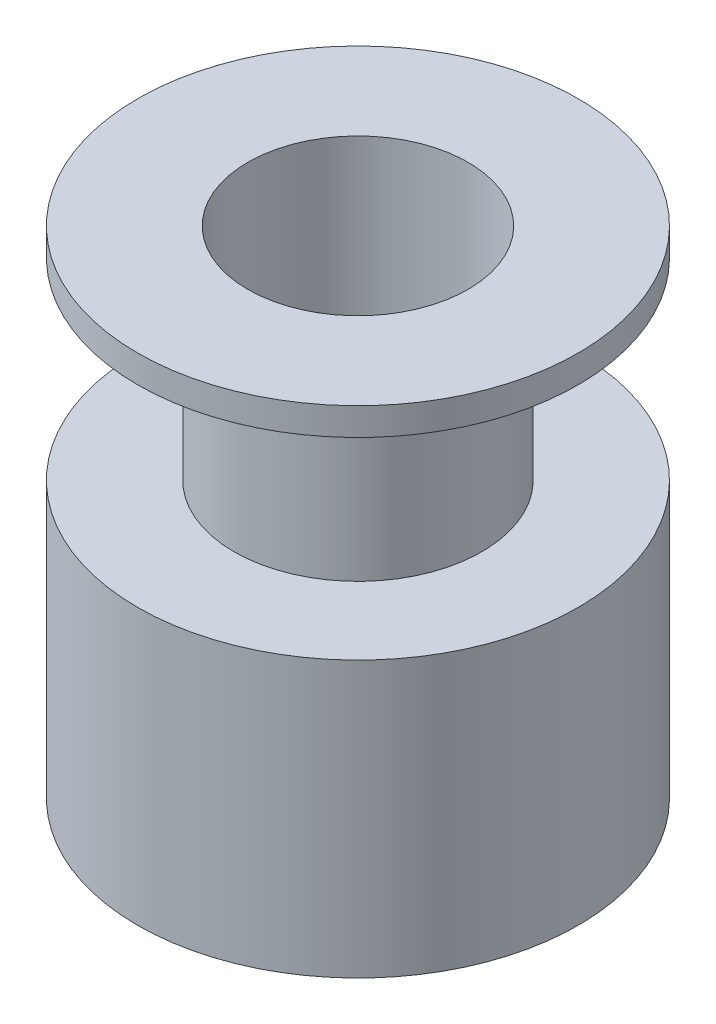
ISO-10303-21;
HEADER;
FILE_DESCRIPTION(('STEP AP214'),'2;1');
FILE_NAME('part.step','',(''),(''),'','','');
FILE_SCHEMA(('AUTOMOTIVE_DESIGN { 1 0 10303 214 1 1 1 1 }'));
ENDSEC;
DATA;
#1=APPLICATION_CONTEXT('core data for automotive mechanical design processes');
#2=APPLICATION_PROTOCOL_DEFINITION('international standard','automotive_design',2000,#1);
#3=PRODUCT_CONTEXT('',#1,'mechanical');
#4=PRODUCT('Part','Part','',(#3));
#5=PRODUCT_RELATED_PRODUCT_CATEGORY('part','',(#4));
#6=PRODUCT_DEFINITION_FORMATION('','',#4);
#7=PRODUCT_DEFINITION_CONTEXT('part definition',#1,'design');
#8=PRODUCT_DEFINITION('design','',#6,#7);
#9=PRODUCT_DEFINITION_SHAPE('','',#8);
#10=(LENGTH_UNIT() NAMED_UNIT(*) SI_UNIT(.MILLI.,.METRE.));
#11=(NAMED_UNIT(*) PLANE_ANGLE_UNIT() SI_UNIT($,.RADIAN.));
#12=(NAMED_UNIT(*) SI_UNIT($,.STERADIAN.) SOLID_ANGLE_UNIT());
#13=UNCERTAINTY_MEASURE_WITH_UNIT(LENGTH_MEASURE(1.E-05),#10,'distance_accuracy_value','');
#14=(GEOMETRIC_REPRESENTATION_CONTEXT(3) GLOBAL_UNCERTAINTY_ASSIGNED_CONTEXT((#13)) GLOBAL_UNIT_ASSIGNED_CONTEXT((#10,
#11,#12)) REPRESENTATION_CONTEXT('',''));
#15=CARTESIAN_POINT('',(0.,0.,0.));
#16=DIRECTION('',(0.,0.,1.));
#17=DIRECTION('',(1.,0.,0.));
#18=AXIS2_PLACEMENT_3D('',#15,#16,#17);
#19=CARTESIAN_POINT('',(0.,18.,0.));
#20=DIRECTION('',(0.,-1.,0.));
#21=DIRECTION('',(0.,0.,-1.));
#22=AXIS2_PLACEMENT_3D('',#19,#20,#21);
#23=CYLINDRICAL_SURFACE('',#22,8.);
#24=CARTESIAN_POINT('',(0.,0.,0.));
#25=DIRECTION('',(0.,1.,0.));
#26=DIRECTION('',(0.,0.,1.));
#27=AXIS2_PLACEMENT_3D('',#24,#25,#26);
#28=CIRCLE('',#27,8.);
#29=CARTESIAN_POINT('',(0.,0.,8.));
#30=VERTEX_POINT('',#29);
#31=EDGE_CURVE('E37',#30,#30,#28,.T.);
#32=ORIENTED_EDGE('',*,*,#31,.T.);
#33=EDGE_LOOP('',(#32));
#34=FACE_BOUND('',#33,.T.);
#35=CARTESIAN_POINT('',(0.,10.,0.));
#36=DIRECTION('',(0.,1.,0.));
#37=DIRECTION('',(0.,0.,1.));
#38=AXIS2_PLACEMENT_3D('',#35,#36,#37);
#39=CIRCLE('',#38,8.);
#40=CARTESIAN_POINT('',(0.,10.,8.));
#41=VERTEX_POINT('',#40);
#42=EDGE_CURVE('E49',#41,#41,#39,.T.);
#43=ORIENTED_EDGE('',*,*,#42,.F.);
#44=EDGE_LOOP('',(#43));
#45=FACE_BOUND('',#44,.T.);
#46=ADVANCED_FACE('F33',(#34,#45),#23,.T.);
#47=CARTESIAN_POINT('',(0.,17.,0.));
#48=DIRECTION('',(0.,1.,0.));
#49=DIRECTION('',(0.,0.,1.));
#50=AXIS2_PLACEMENT_3D('',#47,#48,#49);
#51=CIRCLE('',#50,8.);
#52=CARTESIAN_POINT('',(0.,17.,8.));
#53=VERTEX_POINT('',#52);
#54=EDGE_CURVE('E52',#53,#53,#51,.T.);
#55=ORIENTED_EDGE('',*,*,#54,.T.);
#56=EDGE_LOOP('',(#55));
#57=FACE_BOUND('',#56,.T.);
#58=CARTESIAN_POINT('',(0.,18.,0.));
#59=DIRECTION('',(0.,1.,0.));
#60=DIRECTION('',(0.,0.,1.));
#61=AXIS2_PLACEMENT_3D('',#58,#59,#60);
#62=CIRCLE('',#61,8.);
#63=CARTESIAN_POINT('',(0.,18.,8.));
#64=VERTEX_POINT('',#63);
#65=EDGE_CURVE('E10',#64,#64,#62,.T.);
#66=ORIENTED_EDGE('',*,*,#65,.F.);
#67=EDGE_LOOP('',(#66));
#68=FACE_BOUND('',#67,.T.);
#69=ADVANCED_FACE('F35',(#57,#68),#23,.T.);
#70=CARTESIAN_POINT('',(0.,18.,0.));
#71=DIRECTION('',(0.,1.,0.));
#72=DIRECTION('',(0.,0.,1.));
#73=AXIS2_PLACEMENT_3D('',#70,#71,#72);
#74=PLANE('',#73);
#75=CARTESIAN_POINT('',(0.,18.,0.));
#76=DIRECTION('',(0.,1.,0.));
#77=DIRECTION('',(0.,0.,1.));
#78=AXIS2_PLACEMENT_3D('',#75,#76,#77);
#79=CIRCLE('',#78,4.);
#80=CARTESIAN_POINT('',(0.,18.,4.));
#81=VERTEX_POINT('',#80);
#82=EDGE_CURVE('E46',#81,#81,#79,.T.);
#83=ORIENTED_EDGE('',*,*,#82,.F.);
#84=EDGE_LOOP('',(#83));
#85=FACE_BOUND('',#84,.T.);
#86=ORIENTED_EDGE('',*,*,#65,.T.);
#87=EDGE_LOOP('',(#86));
#88=FACE_BOUND('',#87,.T.);
#89=ADVANCED_FACE('F80',(#85,#88),#74,.T.);
#90=CARTESIAN_POINT('',(0.,0.,0.));
#91=DIRECTION('',(0.,1.,0.));
#92=DIRECTION('',(0.,0.,1.));
#93=AXIS2_PLACEMENT_3D('',#90,#91,#92);
#94=PLANE('',#93);
#95=CARTESIAN_POINT('',(0.,0.,0.));
#96=DIRECTION('',(0.,1.,0.));
#97=DIRECTION('',(0.,0.,1.));
#98=AXIS2_PLACEMENT_3D('',#95,#96,#97);
#99=CIRCLE('',#98,4.);
#100=CARTESIAN_POINT('',(0.,0.,4.));
#101=VERTEX_POINT('',#100);
#102=EDGE_CURVE('E44',#101,#101,#99,.T.);
#103=ORIENTED_EDGE('',*,*,#102,.T.);
#104=EDGE_LOOP('',(#103));
#105=FACE_BOUND('',#104,.T.);
#106=ORIENTED_EDGE('',*,*,#31,.F.);
#107=EDGE_LOOP('',(#106));
#108=FACE_BOUND('',#107,.T.);
#109=ADVANCED_FACE('F84',(#105,#108),#94,.F.);
#110=CARTESIAN_POINT('',(0.,0.,0.));
#111=DIRECTION('',(0.,1.,0.));
#112=DIRECTION('',(0.,0.,1.));
#113=AXIS2_PLACEMENT_3D('',#110,#111,#112);
#114=CYLINDRICAL_SURFACE('',#113,4.);
#115=ORIENTED_EDGE('',*,*,#102,.F.);
#116=EDGE_LOOP('',(#115));
#117=FACE_BOUND('',#116,.T.);
#118=ORIENTED_EDGE('',*,*,#82,.T.);
#119=EDGE_LOOP('',(#118));
#120=FACE_BOUND('',#119,.T.);
#121=ADVANCED_FACE('F71',(#117,#120),#114,.F.);
#122=CARTESIAN_POINT('',(0.,10.,0.));
#123=DIRECTION('',(0.,1.,0.));
#124=DIRECTION('',(0.,0.,1.));
#125=AXIS2_PLACEMENT_3D('',#122,#123,#124);
#126=PLANE('',#125);
#127=CARTESIAN_POINT('',(0.,10.,0.));
#128=DIRECTION('',(0.,1.,0.));
#129=DIRECTION('',(0.,0.,1.));
#130=AXIS2_PLACEMENT_3D('',#127,#128,#129);
#131=CIRCLE('',#130,4.5);
#132=CARTESIAN_POINT('',(0.,10.,4.5));
#133=VERTEX_POINT('',#132);
#134=EDGE_CURVE('E55',#133,#133,#131,.T.);
#135=ORIENTED_EDGE('',*,*,#134,.F.);
#136=EDGE_LOOP('',(#135));
#137=FACE_BOUND('',#136,.T.);
#138=ORIENTED_EDGE('',*,*,#42,.T.);
#139=EDGE_LOOP('',(#138));
#140=FACE_BOUND('',#139,.T.);
#141=ADVANCED_FACE('F67',(#137,#140),#126,.T.);
#142=CARTESIAN_POINT('',(0.,17.,0.));
#143=DIRECTION('',(0.,1.,0.));
#144=DIRECTION('',(0.,0.,1.));
#145=AXIS2_PLACEMENT_3D('',#142,#143,#144);
#146=PLANE('',#145);
#147=CARTESIAN_POINT('',(0.,17.,0.));
#148=DIRECTION('',(0.,1.,0.));
#149=DIRECTION('',(0.,0.,1.));
#150=AXIS2_PLACEMENT_3D('',#147,#148,#149);
#151=CIRCLE('',#150,4.5);
#152=CARTESIAN_POINT('',(0.,17.,4.5));
#153=VERTEX_POINT('',#152);
#154=EDGE_CURVE('E58',#153,#153,#151,.T.);
#155=ORIENTED_EDGE('',*,*,#154,.T.);
#156=EDGE_LOOP('',(#155));
#157=FACE_BOUND('',#156,.T.);
#158=ORIENTED_EDGE('',*,*,#54,.F.);
#159=EDGE_LOOP('',(#158));
#160=FACE_BOUND('',#159,.T.);
#161=ADVANCED_FACE('F70',(#157,#160),#146,.F.);
#162=CARTESIAN_POINT('',(0.,10.,0.));
#163=DIRECTION('',(0.,1.,0.));
#164=DIRECTION('',(0.,0.,1.));
#165=AXIS2_PLACEMENT_3D('',#162,#163,#164);
#166=CYLINDRICAL_SURFACE('',#165,4.5);
#167=ORIENTED_EDGE('',*,*,#134,.T.);
#168=EDGE_LOOP('',(#167));
#169=FACE_BOUND('',#168,.T.);
#170=ORIENTED_EDGE('',*,*,#154,.F.);
#171=EDGE_LOOP('',(#170));
#172=FACE_BOUND('',#171,.T.);
#173=ADVANCED_FACE('F64',(#169,#172),#166,.T.);
#174=CLOSED_SHELL('',(#46,#69,#89,#109,#121,#141,#161,#173));
#175=MANIFOLD_SOLID_BREP('B2',#174);
#176=ADVANCED_BREP_SHAPE_REPRESENTATION('',(#18,#175),#14);
#177=SHAPE_DEFINITION_REPRESENTATION(#9,#176);
ENDSEC;
END-ISO-10303-21;
